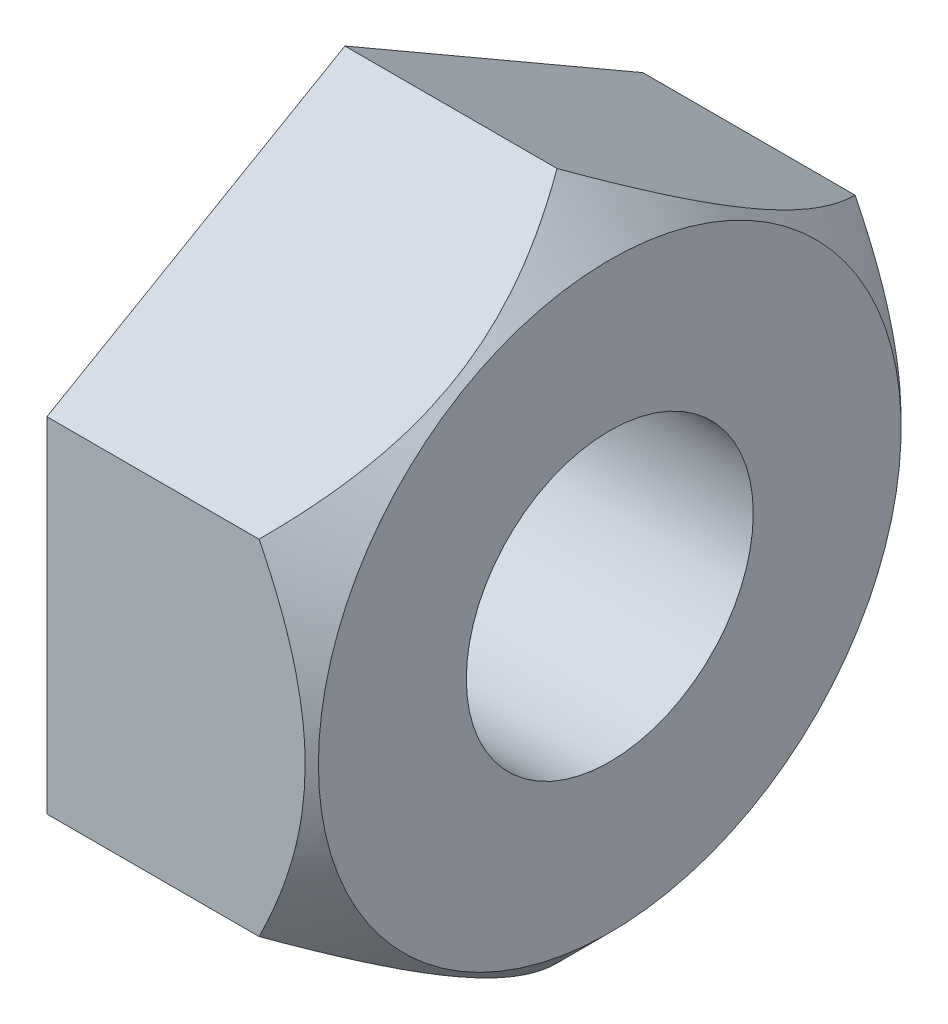
ISO-10303-21;
HEADER;
FILE_DESCRIPTION(('STEP AP214'),'2;1');
FILE_NAME('part.step','',(''),(''),'','','');
FILE_SCHEMA(('AUTOMOTIVE_DESIGN { 1 0 10303 214 1 1 1 1 }'));
ENDSEC;
DATA;
#1=APPLICATION_CONTEXT('core data for automotive mechanical design processes');
#2=APPLICATION_PROTOCOL_DEFINITION('international standard','automotive_design',2000,#1);
#3=PRODUCT_CONTEXT('',#1,'mechanical');
#4=PRODUCT('Part','Part','',(#3));
#5=PRODUCT_RELATED_PRODUCT_CATEGORY('part','',(#4));
#6=PRODUCT_DEFINITION_FORMATION('','',#4);
#7=PRODUCT_DEFINITION_CONTEXT('part definition',#1,'design');
#8=PRODUCT_DEFINITION('design','',#6,#7);
#9=PRODUCT_DEFINITION_SHAPE('','',#8);
#10=(LENGTH_UNIT() NAMED_UNIT(*) SI_UNIT(.MILLI.,.METRE.));
#11=(NAMED_UNIT(*) PLANE_ANGLE_UNIT() SI_UNIT($,.RADIAN.));
#12=(NAMED_UNIT(*) SI_UNIT($,.STERADIAN.) SOLID_ANGLE_UNIT());
#13=UNCERTAINTY_MEASURE_WITH_UNIT(LENGTH_MEASURE(1.E-05),#10,'distance_accuracy_value','');
#14=(GEOMETRIC_REPRESENTATION_CONTEXT(3) GLOBAL_UNCERTAINTY_ASSIGNED_CONTEXT((#13)) GLOBAL_UNIT_ASSIGNED_CONTEXT((#10,
#11,#12)) REPRESENTATION_CONTEXT('',''));
#15=CARTESIAN_POINT('',(0.,0.,0.));
#16=DIRECTION('',(0.,0.,1.));
#17=DIRECTION('',(1.,0.,0.));
#18=AXIS2_PLACEMENT_3D('',#15,#16,#17);
#19=CARTESIAN_POINT('',(12.,13.2,0.));
#20=DIRECTION('',(-1.,0.,0.));
#21=DIRECTION('',(0.,0.,1.));
#22=AXIS2_PLACEMENT_3D('',#19,#20,#21);
#23=PLANE('',#22);
#24=CARTESIAN_POINT('',(12.,0.,0.));
#25=DIRECTION('',(-1.,0.,0.));
#26=DIRECTION('',(0.,0.,1.));
#27=AXIS2_PLACEMENT_3D('',#24,#25,#26);
#28=CIRCLE('',#27,6.5);
#29=CARTESIAN_POINT('',(12.,0.,6.5));
#30=VERTEX_POINT('',#29);
#31=EDGE_CURVE('E206',#30,#30,#28,.T.);
#32=ORIENTED_EDGE('',*,*,#31,.T.);
#33=EDGE_LOOP('',(#32));
#34=FACE_BOUND('',#33,.T.);
#35=CARTESIAN_POINT('',(12.,0.,0.));
#36=DIRECTION('',(-1.,0.,0.));
#37=DIRECTION('',(0.,0.,1.));
#38=AXIS2_PLACEMENT_3D('',#35,#36,#37);
#39=CIRCLE('',#38,13.2);
#40=CARTESIAN_POINT('',(12.,0.,13.2));
#41=VERTEX_POINT('',#40);
#42=EDGE_CURVE('E108',#41,#41,#39,.T.);
#43=ORIENTED_EDGE('',*,*,#42,.F.);
#44=EDGE_LOOP('',(#43));
#45=FACE_BOUND('',#44,.T.);
#46=ADVANCED_FACE('F40',(#34,#45),#23,.F.);
#47=CARTESIAN_POINT('',(12.,0.,0.));
#48=DIRECTION('',(-1.,0.,0.));
#49=DIRECTION('',(0.,0.,1.));
#50=AXIS2_PLACEMENT_3D('',#47,#48,#49);
#51=CONICAL_SURFACE('',#50,13.2,0.785398163397448);
#52=CARTESIAN_POINT('',(9.61142726054327,15.5885727381737,-0.0002));
#53=CARTESIAN_POINT('',(9.74540655653101,15.4545732835372,0.231893863617086));
#54=CARTESIAN_POINT('',(9.87529749903766,15.3195244030607,0.465805386107657));
#55=CARTESIAN_POINT('',(10.1256040216964,15.0471644447738,0.937546671807774));
#56=CARTESIAN_POINT('',(10.2460144271421,14.9098521803264,1.17537849033301));
#57=CARTESIAN_POINT('',(10.4765711450449,14.6321544742578,1.6563650263893));
#58=CARTESIAN_POINT('',(10.5866547423711,14.4917559383323,1.89954242392043));
#59=CARTESIAN_POINT('',(10.7941669626822,14.2086529003149,2.38989126954372));
#60=CARTESIAN_POINT('',(10.8915975204153,14.0659487545296,2.63706210049453));
#61=CARTESIAN_POINT('',(11.070720993791,13.7805289014407,3.13142378753345));
#62=CARTESIAN_POINT('',(11.1526361733832,13.6378482675443,3.37855389469802));
#63=CARTESIAN_POINT('',(11.3009360286315,13.3504869060039,3.87627837301822));
#64=CARTESIAN_POINT('',(11.3673223762266,13.2058063954581,4.12687236814852));
#65=CARTESIAN_POINT('',(11.4828932496898,12.9150641111114,4.63045277654562));
#66=CARTESIAN_POINT('',(11.5321164938364,12.7690062197767,4.88343246518368));
#67=CARTESIAN_POINT('',(11.6122795618845,12.4756642655233,5.39151563394218));
#68=CARTESIAN_POINT('',(11.6432221177628,12.3283803891612,5.64661879093706));
#69=CARTESIAN_POINT('',(11.6951042650618,11.9694600803577,6.26828700165309));
#70=CARTESIAN_POINT('',(11.7059914530467,11.7574357014455,6.63552399837225));
#71=CARTESIAN_POINT('',(11.6877159151004,11.3337704255994,7.36933378154037));
#72=CARTESIAN_POINT('',(11.65853915078,11.1221296891173,7.73590629007867));
#73=CARTESIAN_POINT('',(11.5618578837753,10.7008432751756,8.4655957635642));
#74=CARTESIAN_POINT('',(11.4943105244041,10.4912000954844,8.82870840224951));
#75=CARTESIAN_POINT('',(11.3245597157377,10.0755171095417,9.5486924537443));
#76=CARTESIAN_POINT('',(11.2223589240832,9.86947702823515,9.90556434296283));
#77=CARTESIAN_POINT('',(11.0121088782663,9.5037326177467,10.5390522445132));
#78=CARTESIAN_POINT('',(10.9095908405619,9.34321815730736,10.8170714453436));
#79=CARTESIAN_POINT('',(10.6880356097596,9.02507042067847,11.3681194894979));
#80=CARTESIAN_POINT('',(10.5689979172909,8.86743723174962,11.6411481816817));
#81=CARTESIAN_POINT('',(10.3170714374255,8.55554854682238,12.1813552302816));
#82=CARTESIAN_POINT('',(10.1842262110597,8.40128418082994,12.4485489499779));
#83=CARTESIAN_POINT('',(9.90642846194926,8.09561174196059,12.9779891445731));
#84=CARTESIAN_POINT('',(9.76148336164036,7.94420198685351,13.2402385331801));
#85=CARTESIAN_POINT('',(9.61142726054327,7.79411316400611,13.5002));
#86=B_SPLINE_CURVE_WITH_KNOTS('',3,(#52,#53,#54,#55,#56,#57,#58,#59,#60,#61,#62,#63,#64,#65,#66,
#67,#68,#69,#70,#71,#72,#73,#74,#75,#76,#77,#78,#79,#80,#81,#82,#83,#84,#85),.UNSPECIFIED.,.F.,
.F.,(4,2,2,2,2,2,2,2,2,2,2,2,2,2,2,2,4),(0.,0.898906682289665,1.7983006563812,2.70284417639144,
3.60724922140844,4.4975122452329,5.38767937315672,6.27582517776592,7.16383821888494,
8.43442034474447,9.7054477955843,10.97789767502,12.2502499898109,13.2607780281706,
14.2713366203219,15.278798601815,16.2856470535408),.UNSPECIFIED.);
#87=CARTESIAN_POINT('',(9.6115427318801,15.5884572681199,0.));
#88=VERTEX_POINT('',#87);
#89=CARTESIAN_POINT('',(9.6115427318801,7.79422863405995,13.5));
#90=VERTEX_POINT('',#89);
#91=EDGE_CURVE('E141',#88,#90,#86,.T.);
#92=ORIENTED_EDGE('',*,*,#91,.T.);
#93=CARTESIAN_POINT('',(-2.04827618515007,23.6689365004475,13.5));
#94=CARTESIAN_POINT('',(-1.74459963527135,23.3193222793458,13.5));
#95=CARTESIAN_POINT('',(-1.4418494513152,22.9689004487546,13.5));
#96=CARTESIAN_POINT('',(-0.838473388895204,22.2662232335938,13.5));
#97=CARTESIAN_POINT('',(-0.537847545019115,21.9139678193317,13.5));
#98=CARTESIAN_POINT('',(0.0611383126994442,21.2072513457213,13.5));
#99=CARTESIAN_POINT('',(0.359497201963635,20.8527893325169,13.5));
#100=CARTESIAN_POINT('',(0.953463999990639,20.1415685470893,13.5));
#101=CARTESIAN_POINT('',(1.24907191825587,19.7848097828068,13.5));
#102=CARTESIAN_POINT('',(1.84376852300819,19.0606193833981,13.5));
#103=CARTESIAN_POINT('',(2.14278521902884,18.6931285782257,13.5));
#104=CARTESIAN_POINT('',(2.73699498265318,17.9550693377355,13.5));
#105=CARTESIAN_POINT('',(3.03218807425524,17.5845009217579,13.5));
#106=CARTESIAN_POINT('',(3.61804588902348,16.8399384820357,13.5));
#107=CARTESIAN_POINT('',(3.90871166116484,16.4659452846844,13.5));
#108=CARTESIAN_POINT('',(4.4848019004114,15.713938228185,13.5));
#109=CARTESIAN_POINT('',(4.7702263721456,15.3359243725885,13.5));
#110=CARTESIAN_POINT('',(5.33523141774218,14.5747782617357,13.5));
#111=CARTESIAN_POINT('',(5.61480385613455,14.1916399562571,13.5));
#112=CARTESIAN_POINT('',(6.1664999267836,13.4200187680716,13.5));
#113=CARTESIAN_POINT('',(6.43862347593237,13.0315358258067,13.5));
#114=CARTESIAN_POINT('',(6.97410459774523,12.2480663200605,13.5));
#115=CARTESIAN_POINT('',(7.23745442441445,11.8530744470003,13.5));
#116=CARTESIAN_POINT('',(7.75316570331763,11.055967063718,13.5));
#117=CARTESIAN_POINT('',(8.00552739430763,10.6538517085459,13.5));
#118=CARTESIAN_POINT('',(8.49492470331254,9.84442513155067,13.5));
#119=CARTESIAN_POINT('',(8.73205999087428,9.43717445202993,13.5));
#120=CARTESIAN_POINT('',(9.18988959862124,8.61341441597738,13.5));
#121=CARTESIAN_POINT('',(9.41058193607634,8.19690395071541,13.5));
#122=CARTESIAN_POINT('',(9.83116457536784,7.35419764189471,13.5));
#123=CARTESIAN_POINT('',(10.0310850575299,6.92801697823597,13.5));
#124=CARTESIAN_POINT('',(10.405432534691,6.06468397607687,13.5));
#125=CARTESIAN_POINT('',(10.5798693903336,5.62753595841849,13.5));
#126=CARTESIAN_POINT('',(10.9010178315417,4.73176762270882,13.5));
#127=CARTESIAN_POINT('',(11.0470063519333,4.27288497248723,13.5));
#128=CARTESIAN_POINT('',(11.2991449552983,3.34409780762526,13.5));
#129=CARTESIAN_POINT('',(11.4053013870798,2.87419506216677,13.5));
#130=CARTESIAN_POINT('',(11.529502991556,2.16481894532242,13.5));
#131=CARTESIAN_POINT('',(11.5650098595292,1.92832579057784,13.5));
#132=CARTESIAN_POINT('',(11.6239786553428,1.45385487646528,13.5));
#133=CARTESIAN_POINT('',(11.6474423911053,1.21587734536502,13.5));
#134=CARTESIAN_POINT('',(11.6818791994246,0.739021515727077,13.5));
#135=CARTESIAN_POINT('',(11.6928523877043,0.500143225555352,13.5));
#136=CARTESIAN_POINT('',(11.7020966369145,0.0221384828463681,13.5));
#137=CARTESIAN_POINT('',(11.7003676887357,-0.216987969868742,13.5));
#138=CARTESIAN_POINT('',(11.6842272693561,-0.695212527634173,13.5));
#139=CARTESIAN_POINT('',(11.6697944911553,-0.934309909805955,13.5));
#140=CARTESIAN_POINT('',(11.6284996353987,-1.41142265186281,13.5));
#141=CARTESIAN_POINT('',(11.6016375112965,-1.64943800769246,13.5));
#142=CARTESIAN_POINT('',(11.5359791981658,-2.12382883798405,13.5));
#143=CARTESIAN_POINT('',(11.4971822196031,-2.36020420289645,13.5));
#144=CARTESIAN_POINT('',(11.408328420525,-2.8308405065729,13.5));
#145=CARTESIAN_POINT('',(11.3582697794438,-3.06510109708548,13.5));
#146=CARTESIAN_POINT('',(11.1915785863301,-3.76742469953475,13.5));
#147=CARTESIAN_POINT('',(11.0589005395248,-4.23176415741175,13.5));
#148=CARTESIAN_POINT('',(10.8333073395925,-4.91923422406776,13.5));
#149=CARTESIAN_POINT('',(10.7536727104266,-5.14690250102403,13.5));
#150=CARTESIAN_POINT('',(10.5863782246871,-5.59928936636636,13.5));
#151=CARTESIAN_POINT('',(10.4987181671987,-5.82400788074464,13.5));
#152=CARTESIAN_POINT('',(10.1856998400129,-6.58973724154791,13.5));
#153=CARTESIAN_POINT('',(9.94267403321518,-7.12356297675372,13.5));
#154=CARTESIAN_POINT('',(9.42419644693943,-8.17529737239511,13.5));
#155=CARTESIAN_POINT('',(9.14872605568656,-8.69319667974774,13.5));
#156=CARTESIAN_POINT('',(8.57252606685875,-9.71605543043686,13.5));
#157=CARTESIAN_POINT('',(8.27174565359721,-10.2209860506925,13.5));
#158=CARTESIAN_POINT('',(7.65122168355789,-11.2188316092871,13.5));
#159=CARTESIAN_POINT('',(7.33148188003991,-11.7117488987408,13.5));
#160=CARTESIAN_POINT('',(6.67543265899998,-12.6902320125636,13.5));
#161=CARTESIAN_POINT('',(6.33904337655514,-13.1757440428765,13.5));
#162=CARTESIAN_POINT('',(5.65444475913679,-14.1383576920047,13.5));
#163=CARTESIAN_POINT('',(5.30623497499119,-14.6154589901681,13.5));
#164=CARTESIAN_POINT('',(4.60077029284769,-15.5620595093541,13.5));
#165=CARTESIAN_POINT('',(4.24352618584297,-16.0315667945946,13.5));
#166=CARTESIAN_POINT('',(3.52139837879703,-16.9646399174412,13.5));
#167=CARTESIAN_POINT('',(3.15651484306794,-17.4282058824907,13.5));
#168=CARTESIAN_POINT('',(2.39448477159302,-18.38287091511,13.5));
#169=CARTESIAN_POINT('',(1.99687926446232,-18.8736030716775,13.5));
#170=CARTESIAN_POINT('',(1.19569121302026,-19.8503094643225,13.5));
#171=CARTESIAN_POINT('',(0.792107566090894,-20.3362827945124,13.5));
#172=CARTESIAN_POINT('',(-0.0153983328037662,-21.2986903926648,13.5));
#173=CARTESIAN_POINT('',(-0.419266013280692,-21.7751705154622,13.5));
#174=CARTESIAN_POINT('',(-1.23096215004454,-22.724562653921,13.5));
#175=CARTESIAN_POINT('',(-1.63878970174647,-23.1974754425867,13.5));
#176=CARTESIAN_POINT('',(-2.04827618515007,-23.6689365004475,13.5));
#177=B_SPLINE_CURVE_WITH_KNOTS('',3,(#93,#94,#95,#96,#97,#98,#99,#100,#101,#102,#103,#104,#105,
#106,#107,#108,#109,#110,#111,#112,#113,#114,#115,#116,#117,#118,#119,#120,#121,#122,#123,#124,
#125,#126,#127,#128,#129,#130,#131,#132,#133,#134,#135,#136,#137,#138,#139,#140,#141,#142,#143,
#144,#145,#146,#147,#148,#149,#150,#151,#152,#153,#154,#155,#156,#157,#158,#159,#160,#161,#162,
#163,#164,#165,#166,#167,#168,#169,#170,#171,#172,#173,#174,#175,#176),.UNSPECIFIED.,.F.,.F.,(4,
2,2,2,2,2,2,2,2,2,2,2,2,2,2,2,2,2,2,2,2,2,2,2,2,2,2,2,2,2,2,2,2,2,2,2,2,2,2,2,2,4),(0.,
1.3892626281175,2.77854782384236,4.16848229170007,5.55841195665315,6.97970772309696,
8.40099456462602,9.82194704413419,11.2428982686284,12.6657088150844,14.0885352294976,
15.5125861979659,16.936606208441,18.3500791408029,19.7637222381797,21.1752817927201,
22.5862937029687,24.0294865616727,25.472449293089,26.1896222098296,26.9066874326429,
27.6237460119167,28.3408051054413,29.0590691547184,29.7773358938269,30.4956501591198,
31.214080631003,32.6608012614152,33.3842790046346,34.1077748649139,35.8657728345776,
37.6247842338367,39.3874156025363,41.1496991927024,42.9214605233267,44.6932892553658,
46.4630932355257,48.2328591890072,50.1275784766565,52.0226516918874,53.8964690770884,
55.7698680362675),.UNSPECIFIED.);
#178=CARTESIAN_POINT('',(9.6115427318801,-7.79422863405995,13.5));
#179=VERTEX_POINT('',#178);
#180=EDGE_CURVE('E11',#90,#179,#177,.T.);
#181=ORIENTED_EDGE('',*,*,#180,.T.);
#182=CARTESIAN_POINT('',(9.61142726054327,-7.79411316400611,13.5002));
#183=CARTESIAN_POINT('',(9.74540655653101,-7.9281126186427,13.2681061363829));
#184=CARTESIAN_POINT('',(9.87529749903766,-8.06316149911918,13.0341946138923));
#185=CARTESIAN_POINT('',(10.1256040216964,-8.335521457406,12.5624533281922));
#186=CARTESIAN_POINT('',(10.2460144271421,-8.4728337218534,12.324621509667));
#187=CARTESIAN_POINT('',(10.4765711450449,-8.75053142792209,11.8436349736107));
#188=CARTESIAN_POINT('',(10.5866547423711,-8.89092996384752,11.6004575760796));
#189=CARTESIAN_POINT('',(10.7941669626822,-9.17403300186495,11.1101087304563));
#190=CARTESIAN_POINT('',(10.8915975204153,-9.31673714765022,10.8629378995055));
#191=CARTESIAN_POINT('',(11.070720993791,-9.60215700073918,10.3685762124666));
#192=CARTESIAN_POINT('',(11.1526361733832,-9.74483763463551,10.121446105302));
#193=CARTESIAN_POINT('',(11.3009360286315,-10.0321989961759,9.62372162698178));
#194=CARTESIAN_POINT('',(11.3673223762266,-10.1768795067217,9.37312763185149));
#195=CARTESIAN_POINT('',(11.4828932496898,-10.4676217910684,8.86954722345439));
#196=CARTESIAN_POINT('',(11.5321164938364,-10.6136796824031,8.61656753481632));
#197=CARTESIAN_POINT('',(11.6122795618845,-10.9070216366565,8.10848436605782));
#198=CARTESIAN_POINT('',(11.6432221177628,-11.0543055130187,7.85338120906295));
#199=CARTESIAN_POINT('',(11.6951042650618,-11.4132258218222,7.23171299834691));
#200=CARTESIAN_POINT('',(11.7059914530467,-11.6252502007344,6.86447600162775));
#201=CARTESIAN_POINT('',(11.6877159151004,-12.0489154765805,6.13066621845963));
#202=CARTESIAN_POINT('',(11.65853915078,-12.2605562130626,5.76409370992133));
#203=CARTESIAN_POINT('',(11.5618578837753,-12.6818426270043,5.0344042364358));
#204=CARTESIAN_POINT('',(11.4943105244041,-12.8914858066954,4.6712915977505));
#205=CARTESIAN_POINT('',(11.3245597157377,-13.3071687926382,3.95130754625571));
#206=CARTESIAN_POINT('',(11.2223589240832,-13.5132088739447,3.59443565703717));
#207=CARTESIAN_POINT('',(11.0121088782663,-13.8789532844331,2.96094775548685));
#208=CARTESIAN_POINT('',(10.9095908405619,-14.0394677448725,2.68292855465641));
#209=CARTESIAN_POINT('',(10.6880356097596,-14.3576154815014,2.13188051050213));
#210=CARTESIAN_POINT('',(10.5689979172909,-14.5152486704302,1.85885181831826));
#211=CARTESIAN_POINT('',(10.3170714374255,-14.8271373553575,1.31864476971843));
#212=CARTESIAN_POINT('',(10.1842262110597,-14.9814017213499,1.05145105002212));
#213=CARTESIAN_POINT('',(9.90642846194926,-15.2870741602193,0.522010855426917));
#214=CARTESIAN_POINT('',(9.76148336164036,-15.4384839153263,0.259761466819895));
#215=CARTESIAN_POINT('',(9.61142726054327,-15.5885727381737,-0.000200000000000138));
#216=B_SPLINE_CURVE_WITH_KNOTS('',3,(#182,#183,#184,#185,#186,#187,#188,#189,#190,#191,#192,
#193,#194,#195,#196,#197,#198,#199,#200,#201,#202,#203,#204,#205,#206,#207,#208,#209,#210,#211,
#212,#213,#214,#215),.UNSPECIFIED.,.F.,.F.,(4,2,2,2,2,2,2,2,2,2,2,2,2,2,2,2,4),(0.,
0.898906682289661,1.79830065638119,2.70284417639143,3.60724922140844,4.4975122452329,
5.38767937315672,6.27582517776591,7.16383821888493,8.43442034474447,9.70544779558429,
10.97789767502,12.2502499898108,13.2607780281706,14.2713366203219,15.278798601815,
16.2856470535408),.UNSPECIFIED.);
#217=CARTESIAN_POINT('',(9.6115427318801,-15.5884572681199,0.));
#218=VERTEX_POINT('',#217);
#219=EDGE_CURVE('E53',#179,#218,#216,.T.);
#220=ORIENTED_EDGE('',*,*,#219,.T.);
#221=CARTESIAN_POINT('',(9.61142726054327,-15.5885727381737,0.0002));
#222=CARTESIAN_POINT('',(9.74540655653101,-15.4545732835372,-0.231893863617086));
#223=CARTESIAN_POINT('',(9.87529749903766,-15.3195244030607,-0.465805386107657));
#224=CARTESIAN_POINT('',(10.1256040216964,-15.0471644447738,-0.937546671807774));
#225=CARTESIAN_POINT('',(10.2460144271421,-14.9098521803264,-1.17537849033301));
#226=CARTESIAN_POINT('',(10.4765711450449,-14.6321544742578,-1.6563650263893));
#227=CARTESIAN_POINT('',(10.5866547423711,-14.4917559383323,-1.89954242392043));
#228=CARTESIAN_POINT('',(10.7941669626822,-14.2086529003149,-2.38989126954372));
#229=CARTESIAN_POINT('',(10.8915975204153,-14.0659487545296,-2.63706210049453));
#230=CARTESIAN_POINT('',(11.070720993791,-13.7805289014407,-3.13142378753345));
#231=CARTESIAN_POINT('',(11.1526361733832,-13.6378482675443,-3.37855389469802));
#232=CARTESIAN_POINT('',(11.3009360286315,-13.3504869060039,-3.87627837301822));
#233=CARTESIAN_POINT('',(11.3673223762266,-13.2058063954581,-4.12687236814852));
#234=CARTESIAN_POINT('',(11.4828932496898,-12.9150641111114,-4.63045277654562));
#235=CARTESIAN_POINT('',(11.5321164938364,-12.7690062197767,-4.88343246518368));
#236=CARTESIAN_POINT('',(11.6122795618845,-12.4756642655233,-5.39151563394218));
#237=CARTESIAN_POINT('',(11.6432221177628,-12.3283803891612,-5.64661879093706));
#238=CARTESIAN_POINT('',(11.6951042650618,-11.9694600803577,-6.26828700165309));
#239=CARTESIAN_POINT('',(11.7059914530467,-11.7574357014455,-6.63552399837225));
#240=CARTESIAN_POINT('',(11.6877159151004,-11.3337704255994,-7.36933378154037));
#241=CARTESIAN_POINT('',(11.65853915078,-11.1221296891173,-7.73590629007867));
#242=CARTESIAN_POINT('',(11.5618578837753,-10.7008432751756,-8.4655957635642));
#243=CARTESIAN_POINT('',(11.4943105244041,-10.4912000954844,-8.82870840224951));
#244=CARTESIAN_POINT('',(11.3245597157377,-10.0755171095417,-9.5486924537443));
#245=CARTESIAN_POINT('',(11.2223589240832,-9.86947702823515,-9.90556434296283));
#246=CARTESIAN_POINT('',(11.0121088782663,-9.5037326177467,-10.5390522445132));
#247=CARTESIAN_POINT('',(10.9095908405619,-9.34321815730736,-10.8170714453436));
#248=CARTESIAN_POINT('',(10.6880356097596,-9.02507042067847,-11.3681194894979));
#249=CARTESIAN_POINT('',(10.5689979172909,-8.86743723174962,-11.6411481816817));
#250=CARTESIAN_POINT('',(10.3170714374255,-8.55554854682238,-12.1813552302816));
#251=CARTESIAN_POINT('',(10.1842262110597,-8.40128418082994,-12.4485489499779));
#252=CARTESIAN_POINT('',(9.90642846194926,-8.09561174196059,-12.9779891445731));
#253=CARTESIAN_POINT('',(9.76148336164036,-7.94420198685351,-13.2402385331801));
#254=CARTESIAN_POINT('',(9.61142726054327,-7.79411316400611,-13.5002));
#255=B_SPLINE_CURVE_WITH_KNOTS('',3,(#221,#222,#223,#224,#225,#226,#227,#228,#229,#230,#231,
#232,#233,#234,#235,#236,#237,#238,#239,#240,#241,#242,#243,#244,#245,#246,#247,#248,#249,#250,
#251,#252,#253,#254),.UNSPECIFIED.,.F.,.F.,(4,2,2,2,2,2,2,2,2,2,2,2,2,2,2,2,4),(0.,
0.898906682289665,1.7983006563812,2.70284417639144,3.60724922140844,4.4975122452329,
5.38767937315672,6.27582517776592,7.16383821888494,8.43442034474447,9.7054477955843,
10.97789767502,12.2502499898109,13.2607780281706,14.2713366203219,15.278798601815,
16.2856470535408),.UNSPECIFIED.);
#256=CARTESIAN_POINT('',(9.6115427318801,-7.79422863405995,-13.5));
#257=VERTEX_POINT('',#256);
#258=EDGE_CURVE('E183',#218,#257,#255,.T.);
#259=ORIENTED_EDGE('',*,*,#258,.T.);
#260=CARTESIAN_POINT('',(-2.04827618515007,-23.6689365004475,-13.5));
#261=CARTESIAN_POINT('',(-1.74459963527135,-23.3193222793458,-13.5));
#262=CARTESIAN_POINT('',(-1.4418494513152,-22.9689004487546,-13.5));
#263=CARTESIAN_POINT('',(-0.838473388895204,-22.2662232335938,-13.5));
#264=CARTESIAN_POINT('',(-0.537847545019115,-21.9139678193317,-13.5));
#265=CARTESIAN_POINT('',(0.0611383126994442,-21.2072513457213,-13.5));
#266=CARTESIAN_POINT('',(0.359497201963635,-20.8527893325169,-13.5));
#267=CARTESIAN_POINT('',(0.953463999990639,-20.1415685470893,-13.5));
#268=CARTESIAN_POINT('',(1.24907191825587,-19.7848097828068,-13.5));
#269=CARTESIAN_POINT('',(1.84376852300819,-19.0606193833981,-13.5));
#270=CARTESIAN_POINT('',(2.14278521902884,-18.6931285782257,-13.5));
#271=CARTESIAN_POINT('',(2.73699498265318,-17.9550693377355,-13.5));
#272=CARTESIAN_POINT('',(3.03218807425524,-17.5845009217579,-13.5));
#273=CARTESIAN_POINT('',(3.61804588902348,-16.8399384820357,-13.5));
#274=CARTESIAN_POINT('',(3.90871166116484,-16.4659452846844,-13.5));
#275=CARTESIAN_POINT('',(4.4848019004114,-15.713938228185,-13.5));
#276=CARTESIAN_POINT('',(4.7702263721456,-15.3359243725885,-13.5));
#277=CARTESIAN_POINT('',(5.33523141774218,-14.5747782617357,-13.5));
#278=CARTESIAN_POINT('',(5.61480385613455,-14.1916399562571,-13.5));
#279=CARTESIAN_POINT('',(6.1664999267836,-13.4200187680716,-13.5));
#280=CARTESIAN_POINT('',(6.43862347593237,-13.0315358258067,-13.5));
#281=CARTESIAN_POINT('',(6.97410459774523,-12.2480663200605,-13.5));
#282=CARTESIAN_POINT('',(7.23745442441445,-11.8530744470003,-13.5));
#283=CARTESIAN_POINT('',(7.75316570331763,-11.055967063718,-13.5));
#284=CARTESIAN_POINT('',(8.00552739430763,-10.6538517085459,-13.5));
#285=CARTESIAN_POINT('',(8.49492470331254,-9.84442513155067,-13.5));
#286=CARTESIAN_POINT('',(8.73205999087428,-9.43717445202993,-13.5));
#287=CARTESIAN_POINT('',(9.18988959862124,-8.61341441597738,-13.5));
#288=CARTESIAN_POINT('',(9.41058193607634,-8.19690395071541,-13.5));
#289=CARTESIAN_POINT('',(9.83116457536784,-7.35419764189471,-13.5));
#290=CARTESIAN_POINT('',(10.0310850575299,-6.92801697823597,-13.5));
#291=CARTESIAN_POINT('',(10.405432534691,-6.06468397607687,-13.5));
#292=CARTESIAN_POINT('',(10.5798693903336,-5.62753595841849,-13.5));
#293=CARTESIAN_POINT('',(10.9010178315417,-4.73176762270882,-13.5));
#294=CARTESIAN_POINT('',(11.0470063519333,-4.27288497248723,-13.5));
#295=CARTESIAN_POINT('',(11.2991449552983,-3.34409780762526,-13.5));
#296=CARTESIAN_POINT('',(11.4053013870798,-2.87419506216677,-13.5));
#297=CARTESIAN_POINT('',(11.529502991556,-2.16481894532242,-13.5));
#298=CARTESIAN_POINT('',(11.5650098595292,-1.92832579057784,-13.5));
#299=CARTESIAN_POINT('',(11.6239786553428,-1.45385487646528,-13.5));
#300=CARTESIAN_POINT('',(11.6474423911053,-1.21587734536502,-13.5));
#301=CARTESIAN_POINT('',(11.6818791994246,-0.739021515727077,-13.5));
#302=CARTESIAN_POINT('',(11.6928523877043,-0.500143225555352,-13.5));
#303=CARTESIAN_POINT('',(11.7020966369145,-0.0221384828463681,-13.5));
#304=CARTESIAN_POINT('',(11.7003676887357,0.216987969868742,-13.5));
#305=CARTESIAN_POINT('',(11.6842272693561,0.695212527634173,-13.5));
#306=CARTESIAN_POINT('',(11.6697944911553,0.934309909805955,-13.5));
#307=CARTESIAN_POINT('',(11.6284996353987,1.41142265186281,-13.5));
#308=CARTESIAN_POINT('',(11.6016375112965,1.64943800769246,-13.5));
#309=CARTESIAN_POINT('',(11.5359791981658,2.12382883798405,-13.5));
#310=CARTESIAN_POINT('',(11.4971822196031,2.36020420289645,-13.5));
#311=CARTESIAN_POINT('',(11.408328420525,2.8308405065729,-13.5));
#312=CARTESIAN_POINT('',(11.3582697794438,3.06510109708548,-13.5));
#313=CARTESIAN_POINT('',(11.1915785863301,3.76742469953475,-13.5));
#314=CARTESIAN_POINT('',(11.0589005395248,4.23176415741175,-13.5));
#315=CARTESIAN_POINT('',(10.8333073395925,4.91923422406776,-13.5));
#316=CARTESIAN_POINT('',(10.7536727104266,5.14690250102403,-13.5));
#317=CARTESIAN_POINT('',(10.5863782246871,5.59928936636636,-13.5));
#318=CARTESIAN_POINT('',(10.4987181671987,5.82400788074464,-13.5));
#319=CARTESIAN_POINT('',(10.1856998400129,6.58973724154791,-13.5));
#320=CARTESIAN_POINT('',(9.94267403321518,7.12356297675372,-13.5));
#321=CARTESIAN_POINT('',(9.42419644693943,8.17529737239511,-13.5));
#322=CARTESIAN_POINT('',(9.14872605568656,8.69319667974774,-13.5));
#323=CARTESIAN_POINT('',(8.57252606685875,9.71605543043686,-13.5));
#324=CARTESIAN_POINT('',(8.27174565359721,10.2209860506925,-13.5));
#325=CARTESIAN_POINT('',(7.65122168355789,11.2188316092871,-13.5));
#326=CARTESIAN_POINT('',(7.33148188003991,11.7117488987408,-13.5));
#327=CARTESIAN_POINT('',(6.67543265899998,12.6902320125636,-13.5));
#328=CARTESIAN_POINT('',(6.33904337655514,13.1757440428765,-13.5));
#329=CARTESIAN_POINT('',(5.65444475913679,14.1383576920047,-13.5));
#330=CARTESIAN_POINT('',(5.30623497499119,14.6154589901681,-13.5));
#331=CARTESIAN_POINT('',(4.60077029284769,15.5620595093541,-13.5));
#332=CARTESIAN_POINT('',(4.24352618584297,16.0315667945946,-13.5));
#333=CARTESIAN_POINT('',(3.52139837879703,16.9646399174412,-13.5));
#334=CARTESIAN_POINT('',(3.15651484306794,17.4282058824907,-13.5));
#335=CARTESIAN_POINT('',(2.39448477159302,18.38287091511,-13.5));
#336=CARTESIAN_POINT('',(1.99687926446232,18.8736030716775,-13.5));
#337=CARTESIAN_POINT('',(1.19569121302026,19.8503094643225,-13.5));
#338=CARTESIAN_POINT('',(0.792107566090894,20.3362827945124,-13.5));
#339=CARTESIAN_POINT('',(-0.0153983328037662,21.2986903926648,-13.5));
#340=CARTESIAN_POINT('',(-0.419266013280692,21.7751705154622,-13.5));
#341=CARTESIAN_POINT('',(-1.23096215004454,22.724562653921,-13.5));
#342=CARTESIAN_POINT('',(-1.63878970174647,23.1974754425867,-13.5));
#343=CARTESIAN_POINT('',(-2.04827618515007,23.6689365004475,-13.5));
#344=B_SPLINE_CURVE_WITH_KNOTS('',3,(#260,#261,#262,#263,#264,#265,#266,#267,#268,#269,#270,
#271,#272,#273,#274,#275,#276,#277,#278,#279,#280,#281,#282,#283,#284,#285,#286,#287,#288,#289,
#290,#291,#292,#293,#294,#295,#296,#297,#298,#299,#300,#301,#302,#303,#304,#305,#306,#307,#308,
#309,#310,#311,#312,#313,#314,#315,#316,#317,#318,#319,#320,#321,#322,#323,#324,#325,#326,#327,
#328,#329,#330,#331,#332,#333,#334,#335,#336,#337,#338,#339,#340,#341,#342,#343),.UNSPECIFIED.,
.F.,.F.,(4,2,2,2,2,2,2,2,2,2,2,2,2,2,2,2,2,2,2,2,2,2,2,2,2,2,2,2,2,2,2,2,2,2,2,2,2,2,2,2,2,4),
(0.,1.3892626281175,2.77854782384236,4.16848229170007,5.55841195665315,6.97970772309696,
8.40099456462602,9.82194704413419,11.2428982686284,12.6657088150844,14.0885352294976,
15.5125861979659,16.936606208441,18.3500791408029,19.7637222381797,21.1752817927201,
22.5862937029687,24.0294865616727,25.472449293089,26.1896222098296,26.9066874326429,
27.6237460119167,28.3408051054413,29.0590691547184,29.7773358938269,30.4956501591198,
31.214080631003,32.6608012614152,33.3842790046346,34.1077748649139,35.8657728345776,
37.6247842338367,39.3874156025363,41.1496991927024,42.9214605233267,44.6932892553658,
46.4630932355257,48.2328591890072,50.1275784766565,52.0226516918874,53.8964690770884,
55.7698680362675),.UNSPECIFIED.);
#345=CARTESIAN_POINT('',(9.6115427318801,7.79422863405995,-13.5));
#346=VERTEX_POINT('',#345);
#347=EDGE_CURVE('E176',#257,#346,#344,.T.);
#348=ORIENTED_EDGE('',*,*,#347,.T.);
#349=CARTESIAN_POINT('',(9.61142726054327,7.79411316400611,-13.5002));
#350=CARTESIAN_POINT('',(9.74540655653101,7.9281126186427,-13.2681061363829));
#351=CARTESIAN_POINT('',(9.87529749903766,8.06316149911918,-13.0341946138923));
#352=CARTESIAN_POINT('',(10.1256040216964,8.335521457406,-12.5624533281922));
#353=CARTESIAN_POINT('',(10.2460144271421,8.4728337218534,-12.324621509667));
#354=CARTESIAN_POINT('',(10.4765711450449,8.75053142792209,-11.8436349736107));
#355=CARTESIAN_POINT('',(10.5866547423711,8.89092996384752,-11.6004575760796));
#356=CARTESIAN_POINT('',(10.7941669626822,9.17403300186495,-11.1101087304563));
#357=CARTESIAN_POINT('',(10.8915975204153,9.31673714765022,-10.8629378995055));
#358=CARTESIAN_POINT('',(11.070720993791,9.60215700073918,-10.3685762124666));
#359=CARTESIAN_POINT('',(11.1526361733832,9.74483763463551,-10.121446105302));
#360=CARTESIAN_POINT('',(11.3009360286315,10.0321989961759,-9.62372162698178));
#361=CARTESIAN_POINT('',(11.3673223762266,10.1768795067217,-9.37312763185149));
#362=CARTESIAN_POINT('',(11.4828932496898,10.4676217910684,-8.86954722345439));
#363=CARTESIAN_POINT('',(11.5321164938364,10.6136796824031,-8.61656753481632));
#364=CARTESIAN_POINT('',(11.6122795618845,10.9070216366565,-8.10848436605782));
#365=CARTESIAN_POINT('',(11.6432221177628,11.0543055130187,-7.85338120906295));
#366=CARTESIAN_POINT('',(11.6951042650618,11.4132258218222,-7.23171299834691));
#367=CARTESIAN_POINT('',(11.7059914530467,11.6252502007344,-6.86447600162775));
#368=CARTESIAN_POINT('',(11.6877159151004,12.0489154765805,-6.13066621845963));
#369=CARTESIAN_POINT('',(11.65853915078,12.2605562130626,-5.76409370992133));
#370=CARTESIAN_POINT('',(11.5618578837753,12.6818426270043,-5.0344042364358));
#371=CARTESIAN_POINT('',(11.4943105244041,12.8914858066954,-4.6712915977505));
#372=CARTESIAN_POINT('',(11.3245597157377,13.3071687926382,-3.95130754625571));
#373=CARTESIAN_POINT('',(11.2223589240832,13.5132088739447,-3.59443565703717));
#374=CARTESIAN_POINT('',(11.0121088782663,13.8789532844331,-2.96094775548685));
#375=CARTESIAN_POINT('',(10.9095908405619,14.0394677448725,-2.68292855465641));
#376=CARTESIAN_POINT('',(10.6880356097596,14.3576154815014,-2.13188051050213));
#377=CARTESIAN_POINT('',(10.5689979172909,14.5152486704302,-1.85885181831826));
#378=CARTESIAN_POINT('',(10.3170714374255,14.8271373553575,-1.31864476971843));
#379=CARTESIAN_POINT('',(10.1842262110597,14.9814017213499,-1.05145105002212));
#380=CARTESIAN_POINT('',(9.90642846194926,15.2870741602193,-0.522010855426917));
#381=CARTESIAN_POINT('',(9.76148336164036,15.4384839153263,-0.259761466819895));
#382=CARTESIAN_POINT('',(9.61142726054327,15.5885727381737,0.000200000000000138));
#383=B_SPLINE_CURVE_WITH_KNOTS('',3,(#349,#350,#351,#352,#353,#354,#355,#356,#357,#358,#359,
#360,#361,#362,#363,#364,#365,#366,#367,#368,#369,#370,#371,#372,#373,#374,#375,#376,#377,#378,
#379,#380,#381,#382),.UNSPECIFIED.,.F.,.F.,(4,2,2,2,2,2,2,2,2,2,2,2,2,2,2,2,4),(0.,
0.898906682289661,1.79830065638119,2.70284417639143,3.60724922140844,4.4975122452329,
5.38767937315672,6.27582517776591,7.16383821888493,8.43442034474447,9.70544779558429,
10.97789767502,12.2502499898108,13.2607780281706,14.2713366203219,15.278798601815,
16.2856470535408),.UNSPECIFIED.);
#384=EDGE_CURVE('E149',#346,#88,#383,.T.);
#385=ORIENTED_EDGE('',*,*,#384,.T.);
#386=EDGE_LOOP('',(#92,#181,#220,#259,#348,#385));
#387=FACE_BOUND('',#386,.T.);
#388=ORIENTED_EDGE('',*,*,#42,.T.);
#389=EDGE_LOOP('',(#388));
#390=FACE_BOUND('',#389,.T.);
#391=ADVANCED_FACE('F156',(#387,#390),#51,.T.);
#392=CARTESIAN_POINT('',(12.,7.79422863405995,13.5));
#393=DIRECTION('',(0.,0.,-1.));
#394=DIRECTION('',(-1.,0.,0.));
#395=AXIS2_PLACEMENT_3D('',#392,#393,#394);
#396=PLANE('',#395);
#397=DIRECTION('',(-1.,0.,0.));
#398=VECTOR('',#397,1.);
#399=CARTESIAN_POINT('',(12.,7.79422863405995,13.5));
#400=LINE('',#399,#398);
#401=CARTESIAN_POINT('',(0.,7.79422863405995,13.5));
#402=VERTEX_POINT('',#401);
#403=EDGE_CURVE('E68',#90,#402,#400,.T.);
#404=ORIENTED_EDGE('',*,*,#403,.T.);
#405=DIRECTION('',(0.,-1.,0.));
#406=VECTOR('',#405,1.);
#407=CARTESIAN_POINT('',(0.,7.79422863405995,13.5));
#408=LINE('',#407,#406);
#409=CARTESIAN_POINT('',(0.,-7.79422863405995,13.5));
#410=VERTEX_POINT('',#409);
#411=EDGE_CURVE('E112',#402,#410,#408,.T.);
#412=ORIENTED_EDGE('',*,*,#411,.T.);
#413=DIRECTION('',(-1.,0.,0.));
#414=VECTOR('',#413,1.);
#415=CARTESIAN_POINT('',(12.,-7.79422863405995,13.5));
#416=LINE('',#415,#414);
#417=EDGE_CURVE('E99',#179,#410,#416,.T.);
#418=ORIENTED_EDGE('',*,*,#417,.F.);
#419=ORIENTED_EDGE('',*,*,#180,.F.);
#420=EDGE_LOOP('',(#404,#412,#418,#419));
#421=FACE_BOUND('',#420,.T.);
#422=ADVANCED_FACE('F113',(#421),#396,.F.);
#423=CARTESIAN_POINT('',(12.,-7.79422863405995,13.5));
#424=DIRECTION('',(0.,0.866025403784439,-0.5));
#425=DIRECTION('',(0.,0.5,0.866025403784439));
#426=AXIS2_PLACEMENT_3D('',#423,#424,#425);
#427=PLANE('',#426);
#428=ORIENTED_EDGE('',*,*,#417,.T.);
#429=DIRECTION('',(0.,-0.5,-0.866025403784439));
#430=VECTOR('',#429,1.);
#431=CARTESIAN_POINT('',(0.,-7.79422863405995,13.5));
#432=LINE('',#431,#430);
#433=CARTESIAN_POINT('',(0.,-15.5884572681199,0.));
#434=VERTEX_POINT('',#433);
#435=EDGE_CURVE('E104',#410,#434,#432,.T.);
#436=ORIENTED_EDGE('',*,*,#435,.T.);
#437=DIRECTION('',(-1.,0.,0.));
#438=VECTOR('',#437,1.);
#439=CARTESIAN_POINT('',(12.,-15.5884572681199,0.));
#440=LINE('',#439,#438);
#441=EDGE_CURVE('E109',#218,#434,#440,.T.);
#442=ORIENTED_EDGE('',*,*,#441,.F.);
#443=ORIENTED_EDGE('',*,*,#219,.F.);
#444=EDGE_LOOP('',(#428,#436,#442,#443));
#445=FACE_BOUND('',#444,.T.);
#446=ADVANCED_FACE('F101',(#445),#427,.F.);
#447=CARTESIAN_POINT('',(12.,-15.5884572681199,0.));
#448=DIRECTION('',(0.,0.866025403784439,0.5));
#449=DIRECTION('',(0.,-0.5,0.866025403784439));
#450=AXIS2_PLACEMENT_3D('',#447,#448,#449);
#451=PLANE('',#450);
#452=ORIENTED_EDGE('',*,*,#441,.T.);
#453=DIRECTION('',(0.,0.5,-0.866025403784439));
#454=VECTOR('',#453,1.);
#455=CARTESIAN_POINT('',(0.,-15.5884572681199,0.));
#456=LINE('',#455,#454);
#457=CARTESIAN_POINT('',(0.,-7.79422863405995,-13.5));
#458=VERTEX_POINT('',#457);
#459=EDGE_CURVE('E120',#434,#458,#456,.T.);
#460=ORIENTED_EDGE('',*,*,#459,.T.);
#461=DIRECTION('',(-1.,0.,0.));
#462=VECTOR('',#461,1.);
#463=CARTESIAN_POINT('',(12.,-7.79422863405995,-13.5));
#464=LINE('',#463,#462);
#465=EDGE_CURVE('E136',#257,#458,#464,.T.);
#466=ORIENTED_EDGE('',*,*,#465,.F.);
#467=ORIENTED_EDGE('',*,*,#258,.F.);
#468=EDGE_LOOP('',(#452,#460,#466,#467));
#469=FACE_BOUND('',#468,.T.);
#470=ADVANCED_FACE('F172',(#469),#451,.F.);
#471=CARTESIAN_POINT('',(12.,-7.79422863405995,-13.5));
#472=DIRECTION('',(0.,0.,1.));
#473=DIRECTION('',(1.,0.,0.));
#474=AXIS2_PLACEMENT_3D('',#471,#472,#473);
#475=PLANE('',#474);
#476=ORIENTED_EDGE('',*,*,#465,.T.);
#477=DIRECTION('',(0.,1.,0.));
#478=VECTOR('',#477,1.);
#479=CARTESIAN_POINT('',(0.,-7.79422863405995,-13.5));
#480=LINE('',#479,#478);
#481=CARTESIAN_POINT('',(0.,7.79422863405995,-13.5));
#482=VERTEX_POINT('',#481);
#483=EDGE_CURVE('E122',#458,#482,#480,.T.);
#484=ORIENTED_EDGE('',*,*,#483,.T.);
#485=DIRECTION('',(-1.,0.,0.));
#486=VECTOR('',#485,1.);
#487=CARTESIAN_POINT('',(12.,7.79422863405995,-13.5));
#488=LINE('',#487,#486);
#489=EDGE_CURVE('E134',#346,#482,#488,.T.);
#490=ORIENTED_EDGE('',*,*,#489,.F.);
#491=ORIENTED_EDGE('',*,*,#347,.F.);
#492=EDGE_LOOP('',(#476,#484,#490,#491));
#493=FACE_BOUND('',#492,.T.);
#494=ADVANCED_FACE('F168',(#493),#475,.F.);
#495=CARTESIAN_POINT('',(12.,7.79422863405995,-13.5));
#496=DIRECTION('',(0.,-0.866025403784439,0.5));
#497=DIRECTION('',(0.,-0.5,-0.866025403784439));
#498=AXIS2_PLACEMENT_3D('',#495,#496,#497);
#499=PLANE('',#498);
#500=ORIENTED_EDGE('',*,*,#489,.T.);
#501=DIRECTION('',(0.,0.5,0.866025403784439));
#502=VECTOR('',#501,1.);
#503=CARTESIAN_POINT('',(0.,7.79422863405995,-13.5));
#504=LINE('',#503,#502);
#505=CARTESIAN_POINT('',(0.,15.5884572681199,0.));
#506=VERTEX_POINT('',#505);
#507=EDGE_CURVE('E60',#482,#506,#504,.T.);
#508=ORIENTED_EDGE('',*,*,#507,.T.);
#509=DIRECTION('',(-1.,0.,0.));
#510=VECTOR('',#509,1.);
#511=CARTESIAN_POINT('',(12.,15.5884572681199,0.));
#512=LINE('',#511,#510);
#513=EDGE_CURVE('E132',#88,#506,#512,.T.);
#514=ORIENTED_EDGE('',*,*,#513,.F.);
#515=ORIENTED_EDGE('',*,*,#384,.F.);
#516=EDGE_LOOP('',(#500,#508,#514,#515));
#517=FACE_BOUND('',#516,.T.);
#518=ADVANCED_FACE('F163',(#517),#499,.F.);
#519=CARTESIAN_POINT('',(12.,15.5884572681199,0.));
#520=DIRECTION('',(0.,-0.866025403784439,-0.5));
#521=DIRECTION('',(0.,0.5,-0.866025403784439));
#522=AXIS2_PLACEMENT_3D('',#519,#520,#521);
#523=PLANE('',#522);
#524=ORIENTED_EDGE('',*,*,#513,.T.);
#525=DIRECTION('',(0.,-0.5,0.866025403784439));
#526=VECTOR('',#525,1.);
#527=CARTESIAN_POINT('',(0.,15.5884572681199,0.));
#528=LINE('',#527,#526);
#529=EDGE_CURVE('E129',#506,#402,#528,.T.);
#530=ORIENTED_EDGE('',*,*,#529,.T.);
#531=ORIENTED_EDGE('',*,*,#403,.F.);
#532=ORIENTED_EDGE('',*,*,#91,.F.);
#533=EDGE_LOOP('',(#524,#530,#531,#532));
#534=FACE_BOUND('',#533,.T.);
#535=ADVANCED_FACE('F159',(#534),#523,.F.);
#536=CARTESIAN_POINT('',(0.,0.,0.));
#537=DIRECTION('',(1.,0.,0.));
#538=DIRECTION('',(0.,0.,-1.));
#539=AXIS2_PLACEMENT_3D('',#536,#537,#538);
#540=PLANE('',#539);
#541=CARTESIAN_POINT('',(0.,0.,0.));
#542=DIRECTION('',(-1.,0.,0.));
#543=DIRECTION('',(0.,0.,1.));
#544=AXIS2_PLACEMENT_3D('',#541,#542,#543);
#545=CIRCLE('',#544,6.5);
#546=CARTESIAN_POINT('',(0.,0.,6.5));
#547=VERTEX_POINT('',#546);
#548=EDGE_CURVE('E116',#547,#547,#545,.T.);
#549=ORIENTED_EDGE('',*,*,#548,.F.);
#550=EDGE_LOOP('',(#549));
#551=FACE_BOUND('',#550,.T.);
#552=ORIENTED_EDGE('',*,*,#435,.F.);
#553=ORIENTED_EDGE('',*,*,#411,.F.);
#554=ORIENTED_EDGE('',*,*,#529,.F.);
#555=ORIENTED_EDGE('',*,*,#507,.F.);
#556=ORIENTED_EDGE('',*,*,#483,.F.);
#557=ORIENTED_EDGE('',*,*,#459,.F.);
#558=EDGE_LOOP('',(#552,#553,#554,#555,#556,#557));
#559=FACE_BOUND('',#558,.T.);
#560=ADVANCED_FACE('F42',(#551,#559),#540,.F.);
#561=CARTESIAN_POINT('',(12.,0.,0.));
#562=DIRECTION('',(-1.,0.,0.));
#563=DIRECTION('',(0.,0.,1.));
#564=AXIS2_PLACEMENT_3D('',#561,#562,#563);
#565=CYLINDRICAL_SURFACE('',#564,6.5);
#566=ORIENTED_EDGE('',*,*,#548,.T.);
#567=EDGE_LOOP('',(#566));
#568=FACE_BOUND('',#567,.T.);
#569=ORIENTED_EDGE('',*,*,#31,.F.);
#570=EDGE_LOOP('',(#569));
#571=FACE_BOUND('',#570,.T.);
#572=ADVANCED_FACE('F164',(#568,#571),#565,.F.);
#573=CLOSED_SHELL('',(#46,#391,#422,#446,#470,#494,#518,#535,#560,#572));
#574=MANIFOLD_SOLID_BREP('B2',#573);
#575=ADVANCED_BREP_SHAPE_REPRESENTATION('',(#18,#574),#14);
#576=SHAPE_DEFINITION_REPRESENTATION(#9,#575);
ENDSEC;
END-ISO-10303-21;
